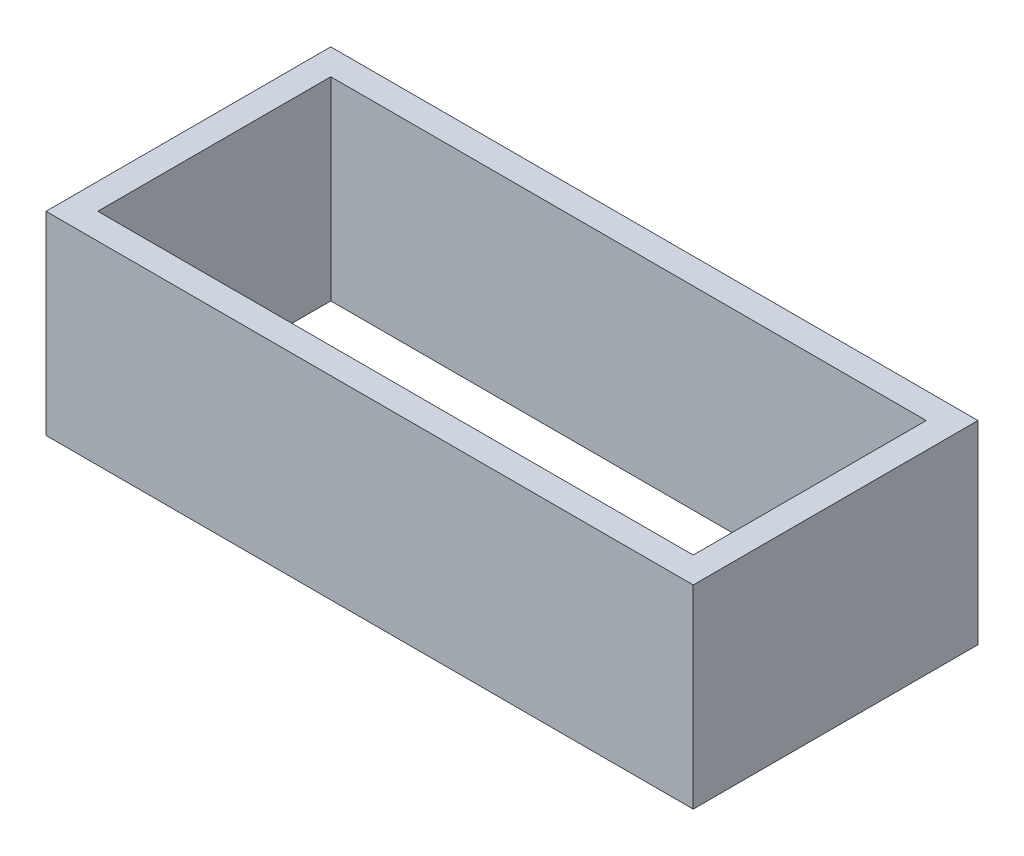
ISO-10303-21;
HEADER;
FILE_DESCRIPTION(('STEP AP214'),'2;1');
FILE_NAME('part.step','',(''),(''),'','','');
FILE_SCHEMA(('AUTOMOTIVE_DESIGN { 1 0 10303 214 1 1 1 1 }'));
ENDSEC;
DATA;
#1=APPLICATION_CONTEXT('core data for automotive mechanical design processes');
#2=APPLICATION_PROTOCOL_DEFINITION('international standard','automotive_design',2000,#1);
#3=PRODUCT_CONTEXT('',#1,'mechanical');
#4=PRODUCT('Part','Part','',(#3));
#5=PRODUCT_RELATED_PRODUCT_CATEGORY('part','',(#4));
#6=PRODUCT_DEFINITION_FORMATION('','',#4);
#7=PRODUCT_DEFINITION_CONTEXT('part definition',#1,'design');
#8=PRODUCT_DEFINITION('design','',#6,#7);
#9=PRODUCT_DEFINITION_SHAPE('','',#8);
#10=(LENGTH_UNIT() NAMED_UNIT(*) SI_UNIT(.MILLI.,.METRE.));
#11=(NAMED_UNIT(*) PLANE_ANGLE_UNIT() SI_UNIT($,.RADIAN.));
#12=(NAMED_UNIT(*) SI_UNIT($,.STERADIAN.) SOLID_ANGLE_UNIT());
#13=UNCERTAINTY_MEASURE_WITH_UNIT(LENGTH_MEASURE(1.E-05),#10,'distance_accuracy_value','');
#14=(GEOMETRIC_REPRESENTATION_CONTEXT(3) GLOBAL_UNCERTAINTY_ASSIGNED_CONTEXT((#13)) GLOBAL_UNIT_ASSIGNED_CONTEXT((#10,
#11,#12)) REPRESENTATION_CONTEXT('',''));
#15=CARTESIAN_POINT('',(0.,0.,0.));
#16=DIRECTION('',(0.,0.,1.));
#17=DIRECTION('',(1.,0.,0.));
#18=AXIS2_PLACEMENT_3D('',#15,#16,#17);
#19=CARTESIAN_POINT('',(0.,30.,0.));
#20=DIRECTION('',(0.,-1.,0.));
#21=DIRECTION('',(0.,0.,-1.));
#22=AXIS2_PLACEMENT_3D('',#19,#20,#21);
#23=PLANE('',#22);
#24=DIRECTION('',(0.,0.,-1.));
#25=VECTOR('',#24,1.);
#26=CARTESIAN_POINT('',(50.,30.,22.));
#27=LINE('',#26,#25);
#28=CARTESIAN_POINT('',(50.,30.,22.));
#29=VERTEX_POINT('',#28);
#30=CARTESIAN_POINT('',(50.,30.,-22.));
#31=VERTEX_POINT('',#30);
#32=EDGE_CURVE('E144',#29,#31,#27,.T.);
#33=ORIENTED_EDGE('',*,*,#32,.T.);
#34=DIRECTION('',(-1.,0.,0.));
#35=VECTOR('',#34,1.);
#36=CARTESIAN_POINT('',(-50.,30.,-22.));
#37=LINE('',#36,#35);
#38=CARTESIAN_POINT('',(-50.,30.,-22.));
#39=VERTEX_POINT('',#38);
#40=EDGE_CURVE('E147',#31,#39,#37,.T.);
#41=ORIENTED_EDGE('',*,*,#40,.T.);
#42=DIRECTION('',(0.,0.,1.));
#43=VECTOR('',#42,1.);
#44=CARTESIAN_POINT('',(-50.,30.,22.));
#45=LINE('',#44,#43);
#46=CARTESIAN_POINT('',(-50.,30.,22.));
#47=VERTEX_POINT('',#46);
#48=EDGE_CURVE('E150',#39,#47,#45,.T.);
#49=ORIENTED_EDGE('',*,*,#48,.T.);
#50=DIRECTION('',(1.,0.,0.));
#51=VECTOR('',#50,1.);
#52=CARTESIAN_POINT('',(-50.,30.,22.));
#53=LINE('',#52,#51);
#54=EDGE_CURVE('E152',#47,#29,#53,.T.);
#55=ORIENTED_EDGE('',*,*,#54,.T.);
#56=EDGE_LOOP('',(#33,#41,#49,#55));
#57=FACE_BOUND('',#56,.T.);
#58=DIRECTION('',(0.,0.,-1.));
#59=VECTOR('',#58,1.);
#60=CARTESIAN_POINT('',(46.,30.,-18.));
#61=LINE('',#60,#59);
#62=CARTESIAN_POINT('',(46.,30.,18.));
#63=VERTEX_POINT('',#62);
#64=CARTESIAN_POINT('',(46.,30.,-18.));
#65=VERTEX_POINT('',#64);
#66=EDGE_CURVE('E108',#63,#65,#61,.T.);
#67=ORIENTED_EDGE('',*,*,#66,.F.);
#68=DIRECTION('',(1.,0.,0.));
#69=VECTOR('',#68,1.);
#70=CARTESIAN_POINT('',(-46.,30.,18.));
#71=LINE('',#70,#69);
#72=CARTESIAN_POINT('',(-46.,30.,18.));
#73=VERTEX_POINT('',#72);
#74=EDGE_CURVE('E130',#73,#63,#71,.T.);
#75=ORIENTED_EDGE('',*,*,#74,.F.);
#76=DIRECTION('',(0.,0.,1.));
#77=VECTOR('',#76,1.);
#78=CARTESIAN_POINT('',(-46.,30.,-18.));
#79=LINE('',#78,#77);
#80=CARTESIAN_POINT('',(-46.,30.,-18.));
#81=VERTEX_POINT('',#80);
#82=EDGE_CURVE('E128',#81,#73,#79,.T.);
#83=ORIENTED_EDGE('',*,*,#82,.F.);
#84=DIRECTION('',(-1.,0.,0.));
#85=VECTOR('',#84,1.);
#86=CARTESIAN_POINT('',(-46.,30.,-18.));
#87=LINE('',#86,#85);
#88=EDGE_CURVE('E116',#65,#81,#87,.T.);
#89=ORIENTED_EDGE('',*,*,#88,.F.);
#90=EDGE_LOOP('',(#67,#75,#83,#89));
#91=FACE_BOUND('',#90,.T.);
#92=ADVANCED_FACE('F43',(#57,#91),#23,.F.);
#93=CARTESIAN_POINT('',(0.,0.,0.));
#94=DIRECTION('',(0.,-1.,0.));
#95=DIRECTION('',(0.,0.,-1.));
#96=AXIS2_PLACEMENT_3D('',#93,#94,#95);
#97=PLANE('',#96);
#98=DIRECTION('',(0.,0.,-1.));
#99=VECTOR('',#98,1.);
#100=CARTESIAN_POINT('',(50.,0.,22.));
#101=LINE('',#100,#99);
#102=CARTESIAN_POINT('',(50.,0.,22.));
#103=VERTEX_POINT('',#102);
#104=CARTESIAN_POINT('',(50.,0.,-22.));
#105=VERTEX_POINT('',#104);
#106=EDGE_CURVE('E124',#103,#105,#101,.T.);
#107=ORIENTED_EDGE('',*,*,#106,.F.);
#108=DIRECTION('',(1.,0.,0.));
#109=VECTOR('',#108,1.);
#110=CARTESIAN_POINT('',(-50.,0.,22.));
#111=LINE('',#110,#109);
#112=CARTESIAN_POINT('',(-50.,0.,22.));
#113=VERTEX_POINT('',#112);
#114=EDGE_CURVE('E148',#113,#103,#111,.T.);
#115=ORIENTED_EDGE('',*,*,#114,.F.);
#116=DIRECTION('',(0.,0.,1.));
#117=VECTOR('',#116,1.);
#118=CARTESIAN_POINT('',(-50.,0.,22.));
#119=LINE('',#118,#117);
#120=CARTESIAN_POINT('',(-50.,0.,-22.));
#121=VERTEX_POINT('',#120);
#122=EDGE_CURVE('E159',#121,#113,#119,.T.);
#123=ORIENTED_EDGE('',*,*,#122,.F.);
#124=DIRECTION('',(-1.,0.,0.));
#125=VECTOR('',#124,1.);
#126=CARTESIAN_POINT('',(-50.,0.,-22.));
#127=LINE('',#126,#125);
#128=EDGE_CURVE('E157',#105,#121,#127,.T.);
#129=ORIENTED_EDGE('',*,*,#128,.F.);
#130=EDGE_LOOP('',(#107,#115,#123,#129));
#131=FACE_BOUND('',#130,.T.);
#132=DIRECTION('',(1.,0.,0.));
#133=VECTOR('',#132,1.);
#134=CARTESIAN_POINT('',(-46.,0.,18.));
#135=LINE('',#134,#133);
#136=CARTESIAN_POINT('',(-46.,0.,18.));
#137=VERTEX_POINT('',#136);
#138=CARTESIAN_POINT('',(46.,0.,18.));
#139=VERTEX_POINT('',#138);
#140=EDGE_CURVE('E117',#137,#139,#135,.T.);
#141=ORIENTED_EDGE('',*,*,#140,.T.);
#142=DIRECTION('',(0.,0.,-1.));
#143=VECTOR('',#142,1.);
#144=CARTESIAN_POINT('',(46.,0.,-18.));
#145=LINE('',#144,#143);
#146=CARTESIAN_POINT('',(46.,0.,-18.));
#147=VERTEX_POINT('',#146);
#148=EDGE_CURVE('E66',#139,#147,#145,.T.);
#149=ORIENTED_EDGE('',*,*,#148,.T.);
#150=DIRECTION('',(-1.,0.,0.));
#151=VECTOR('',#150,1.);
#152=CARTESIAN_POINT('',(-46.,0.,-18.));
#153=LINE('',#152,#151);
#154=CARTESIAN_POINT('',(-46.,0.,-18.));
#155=VERTEX_POINT('',#154);
#156=EDGE_CURVE('E123',#147,#155,#153,.T.);
#157=ORIENTED_EDGE('',*,*,#156,.T.);
#158=DIRECTION('',(0.,0.,1.));
#159=VECTOR('',#158,1.);
#160=CARTESIAN_POINT('',(-46.,0.,-18.));
#161=LINE('',#160,#159);
#162=EDGE_CURVE('E136',#155,#137,#161,.T.);
#163=ORIENTED_EDGE('',*,*,#162,.T.);
#164=EDGE_LOOP('',(#141,#149,#157,#163));
#165=FACE_BOUND('',#164,.T.);
#166=ADVANCED_FACE('F177',(#131,#165),#97,.T.);
#167=CARTESIAN_POINT('',(50.,30.,22.));
#168=DIRECTION('',(-1.,0.,0.));
#169=DIRECTION('',(0.,0.,1.));
#170=AXIS2_PLACEMENT_3D('',#167,#168,#169);
#171=PLANE('',#170);
#172=ORIENTED_EDGE('',*,*,#106,.T.);
#173=DIRECTION('',(0.,-1.,0.));
#174=VECTOR('',#173,1.);
#175=CARTESIAN_POINT('',(50.,30.,-22.));
#176=LINE('',#175,#174);
#177=EDGE_CURVE('E11',#31,#105,#176,.T.);
#178=ORIENTED_EDGE('',*,*,#177,.F.);
#179=ORIENTED_EDGE('',*,*,#32,.F.);
#180=DIRECTION('',(0.,-1.,0.));
#181=VECTOR('',#180,1.);
#182=CARTESIAN_POINT('',(50.,30.,22.));
#183=LINE('',#182,#181);
#184=EDGE_CURVE('E154',#29,#103,#183,.T.);
#185=ORIENTED_EDGE('',*,*,#184,.T.);
#186=EDGE_LOOP('',(#172,#178,#179,#185));
#187=FACE_BOUND('',#186,.T.);
#188=ADVANCED_FACE('F45',(#187),#171,.F.);
#189=CARTESIAN_POINT('',(-50.,30.,-22.));
#190=DIRECTION('',(0.,0.,1.));
#191=DIRECTION('',(1.,0.,0.));
#192=AXIS2_PLACEMENT_3D('',#189,#190,#191);
#193=PLANE('',#192);
#194=ORIENTED_EDGE('',*,*,#128,.T.);
#195=DIRECTION('',(0.,-1.,0.));
#196=VECTOR('',#195,1.);
#197=CARTESIAN_POINT('',(-50.,30.,-22.));
#198=LINE('',#197,#196);
#199=EDGE_CURVE('E51',#39,#121,#198,.T.);
#200=ORIENTED_EDGE('',*,*,#199,.F.);
#201=ORIENTED_EDGE('',*,*,#40,.F.);
#202=ORIENTED_EDGE('',*,*,#177,.T.);
#203=EDGE_LOOP('',(#194,#200,#201,#202));
#204=FACE_BOUND('',#203,.T.);
#205=ADVANCED_FACE('F187',(#204),#193,.F.);
#206=CARTESIAN_POINT('',(-50.,30.,22.));
#207=DIRECTION('',(1.,0.,0.));
#208=DIRECTION('',(0.,0.,-1.));
#209=AXIS2_PLACEMENT_3D('',#206,#207,#208);
#210=PLANE('',#209);
#211=ORIENTED_EDGE('',*,*,#122,.T.);
#212=DIRECTION('',(0.,-1.,0.));
#213=VECTOR('',#212,1.);
#214=CARTESIAN_POINT('',(-50.,30.,22.));
#215=LINE('',#214,#213);
#216=EDGE_CURVE('E164',#47,#113,#215,.T.);
#217=ORIENTED_EDGE('',*,*,#216,.F.);
#218=ORIENTED_EDGE('',*,*,#48,.F.);
#219=ORIENTED_EDGE('',*,*,#199,.T.);
#220=EDGE_LOOP('',(#211,#217,#218,#219));
#221=FACE_BOUND('',#220,.T.);
#222=ADVANCED_FACE('F171',(#221),#210,.F.);
#223=CARTESIAN_POINT('',(-50.,30.,22.));
#224=DIRECTION('',(0.,0.,-1.));
#225=DIRECTION('',(-1.,0.,0.));
#226=AXIS2_PLACEMENT_3D('',#223,#224,#225);
#227=PLANE('',#226);
#228=ORIENTED_EDGE('',*,*,#114,.T.);
#229=ORIENTED_EDGE('',*,*,#184,.F.);
#230=ORIENTED_EDGE('',*,*,#54,.F.);
#231=ORIENTED_EDGE('',*,*,#216,.T.);
#232=EDGE_LOOP('',(#228,#229,#230,#231));
#233=FACE_BOUND('',#232,.T.);
#234=ADVANCED_FACE('F181',(#233),#227,.F.);
#235=CARTESIAN_POINT('',(46.,30.,-18.));
#236=DIRECTION('',(-1.,0.,0.));
#237=DIRECTION('',(0.,0.,1.));
#238=AXIS2_PLACEMENT_3D('',#235,#236,#237);
#239=PLANE('',#238);
#240=ORIENTED_EDGE('',*,*,#148,.F.);
#241=DIRECTION('',(0.,-1.,0.));
#242=VECTOR('',#241,1.);
#243=CARTESIAN_POINT('',(46.,30.,18.));
#244=LINE('',#243,#242);
#245=EDGE_CURVE('E112',#63,#139,#244,.T.);
#246=ORIENTED_EDGE('',*,*,#245,.F.);
#247=ORIENTED_EDGE('',*,*,#66,.T.);
#248=DIRECTION('',(0.,-1.,0.));
#249=VECTOR('',#248,1.);
#250=CARTESIAN_POINT('',(46.,30.,-18.));
#251=LINE('',#250,#249);
#252=EDGE_CURVE('E111',#65,#147,#251,.T.);
#253=ORIENTED_EDGE('',*,*,#252,.T.);
#254=EDGE_LOOP('',(#240,#246,#247,#253));
#255=FACE_BOUND('',#254,.T.);
#256=ADVANCED_FACE('F110',(#255),#239,.T.);
#257=CARTESIAN_POINT('',(-46.,30.,-18.));
#258=DIRECTION('',(0.,0.,1.));
#259=DIRECTION('',(1.,0.,0.));
#260=AXIS2_PLACEMENT_3D('',#257,#258,#259);
#261=PLANE('',#260);
#262=ORIENTED_EDGE('',*,*,#156,.F.);
#263=ORIENTED_EDGE('',*,*,#252,.F.);
#264=ORIENTED_EDGE('',*,*,#88,.T.);
#265=DIRECTION('',(0.,-1.,0.));
#266=VECTOR('',#265,1.);
#267=CARTESIAN_POINT('',(-46.,30.,-18.));
#268=LINE('',#267,#266);
#269=EDGE_CURVE('E125',#81,#155,#268,.T.);
#270=ORIENTED_EDGE('',*,*,#269,.T.);
#271=EDGE_LOOP('',(#262,#263,#264,#270));
#272=FACE_BOUND('',#271,.T.);
#273=ADVANCED_FACE('F120',(#272),#261,.T.);
#274=CARTESIAN_POINT('',(-46.,30.,-18.));
#275=DIRECTION('',(1.,0.,0.));
#276=DIRECTION('',(0.,0.,-1.));
#277=AXIS2_PLACEMENT_3D('',#274,#275,#276);
#278=PLANE('',#277);
#279=ORIENTED_EDGE('',*,*,#162,.F.);
#280=ORIENTED_EDGE('',*,*,#269,.F.);
#281=ORIENTED_EDGE('',*,*,#82,.T.);
#282=DIRECTION('',(0.,-1.,0.));
#283=VECTOR('',#282,1.);
#284=CARTESIAN_POINT('',(-46.,30.,18.));
#285=LINE('',#284,#283);
#286=EDGE_CURVE('E58',#73,#137,#285,.T.);
#287=ORIENTED_EDGE('',*,*,#286,.T.);
#288=EDGE_LOOP('',(#279,#280,#281,#287));
#289=FACE_BOUND('',#288,.T.);
#290=ADVANCED_FACE('F210',(#289),#278,.T.);
#291=CARTESIAN_POINT('',(-46.,30.,18.));
#292=DIRECTION('',(0.,0.,-1.));
#293=DIRECTION('',(-1.,0.,0.));
#294=AXIS2_PLACEMENT_3D('',#291,#292,#293);
#295=PLANE('',#294);
#296=ORIENTED_EDGE('',*,*,#140,.F.);
#297=ORIENTED_EDGE('',*,*,#286,.F.);
#298=ORIENTED_EDGE('',*,*,#74,.T.);
#299=ORIENTED_EDGE('',*,*,#245,.T.);
#300=EDGE_LOOP('',(#296,#297,#298,#299));
#301=FACE_BOUND('',#300,.T.);
#302=ADVANCED_FACE('F214',(#301),#295,.T.);
#303=CLOSED_SHELL('',(#92,#166,#188,#205,#222,#234,#256,#273,#290,#302));
#304=MANIFOLD_SOLID_BREP('B2',#303);
#305=ADVANCED_BREP_SHAPE_REPRESENTATION('',(#18,#304),#14);
#306=SHAPE_DEFINITION_REPRESENTATION(#9,#305);
ENDSEC;
END-ISO-10303-21;
